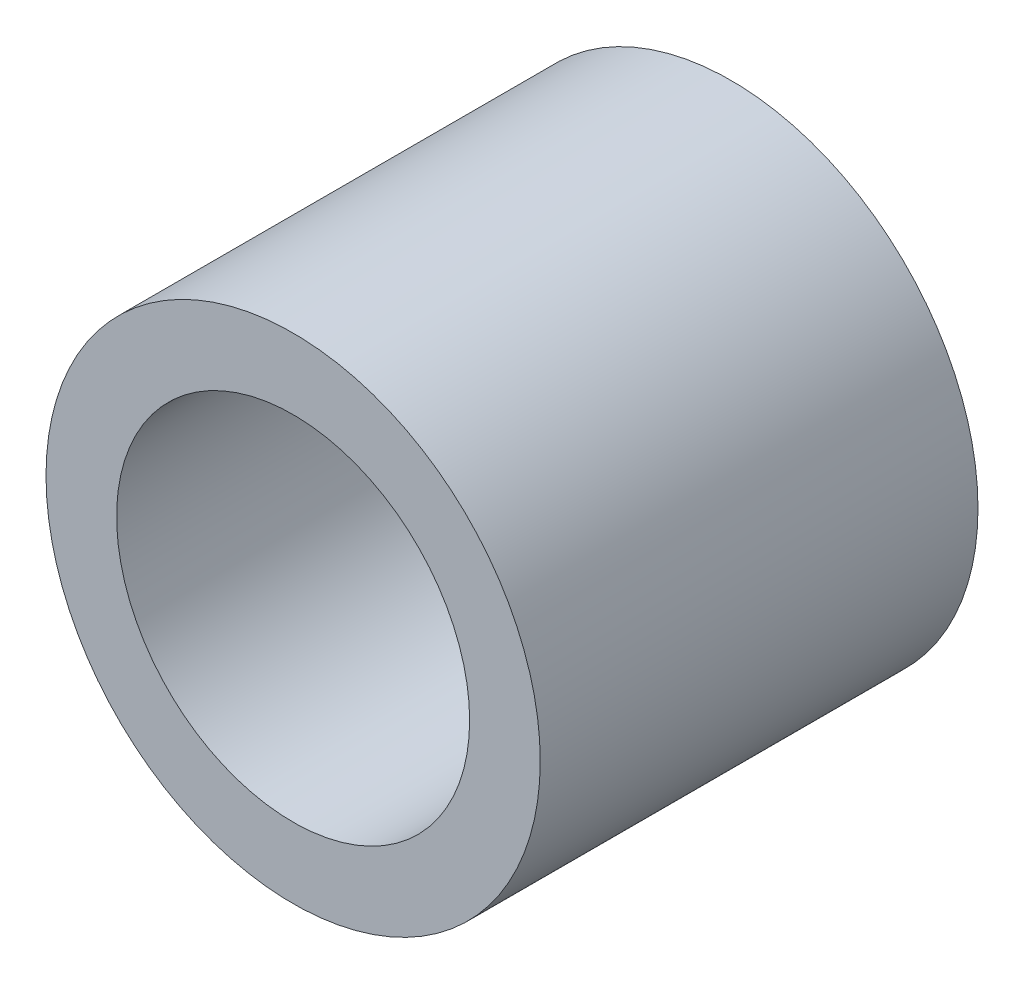
ISO-10303-21;
HEADER;
FILE_DESCRIPTION(('STEP AP214'),'2;1');
FILE_NAME('part.step','',(''),(''),'','','');
FILE_SCHEMA(('AUTOMOTIVE_DESIGN { 1 0 10303 214 1 1 1 1 }'));
ENDSEC;
DATA;
#1=APPLICATION_CONTEXT('core data for automotive mechanical design processes');
#2=APPLICATION_PROTOCOL_DEFINITION('international standard','automotive_design',2000,#1);
#3=PRODUCT_CONTEXT('',#1,'mechanical');
#4=PRODUCT('Part','Part','',(#3));
#5=PRODUCT_RELATED_PRODUCT_CATEGORY('part','',(#4));
#6=PRODUCT_DEFINITION_FORMATION('','',#4);
#7=PRODUCT_DEFINITION_CONTEXT('part definition',#1,'design');
#8=PRODUCT_DEFINITION('design','',#6,#7);
#9=PRODUCT_DEFINITION_SHAPE('','',#8);
#10=(LENGTH_UNIT() NAMED_UNIT(*) SI_UNIT(.MILLI.,.METRE.));
#11=(NAMED_UNIT(*) PLANE_ANGLE_UNIT() SI_UNIT($,.RADIAN.));
#12=(NAMED_UNIT(*) SI_UNIT($,.STERADIAN.) SOLID_ANGLE_UNIT());
#13=UNCERTAINTY_MEASURE_WITH_UNIT(LENGTH_MEASURE(1.E-05),#10,'distance_accuracy_value','');
#14=(GEOMETRIC_REPRESENTATION_CONTEXT(3) GLOBAL_UNCERTAINTY_ASSIGNED_CONTEXT((#13)) GLOBAL_UNIT_ASSIGNED_CONTEXT((#10,
#11,#12)) REPRESENTATION_CONTEXT('',''));
#15=CARTESIAN_POINT('',(0.,0.,0.));
#16=DIRECTION('',(0.,0.,1.));
#17=DIRECTION('',(1.,0.,0.));
#18=AXIS2_PLACEMENT_3D('',#15,#16,#17);
#19=CARTESIAN_POINT('',(0.,0.,31.));
#20=DIRECTION('',(0.,0.,1.));
#21=DIRECTION('',(1.,0.,0.));
#22=AXIS2_PLACEMENT_3D('',#19,#20,#21);
#23=PLANE('',#22);
#24=CARTESIAN_POINT('',(0.,0.,31.));
#25=DIRECTION('',(0.,0.,1.));
#26=DIRECTION('',(1.,0.,0.));
#27=AXIS2_PLACEMENT_3D('',#24,#25,#26);
#28=CIRCLE('',#27,17.5);
#29=CARTESIAN_POINT('',(17.5,0.,31.));
#30=VERTEX_POINT('',#29);
#31=EDGE_CURVE('E10',#30,#30,#28,.T.);
#32=ORIENTED_EDGE('',*,*,#31,.T.);
#33=EDGE_LOOP('',(#32));
#34=FACE_BOUND('',#33,.T.);
#35=CARTESIAN_POINT('',(0.,0.,31.));
#36=DIRECTION('',(0.,0.,1.));
#37=DIRECTION('',(1.,0.,0.));
#38=AXIS2_PLACEMENT_3D('',#35,#36,#37);
#39=CIRCLE('',#38,12.5);
#40=CARTESIAN_POINT('',(12.5,0.,31.));
#41=VERTEX_POINT('',#40);
#42=EDGE_CURVE('E41',#41,#41,#39,.T.);
#43=ORIENTED_EDGE('',*,*,#42,.F.);
#44=EDGE_LOOP('',(#43));
#45=FACE_BOUND('',#44,.T.);
#46=ADVANCED_FACE('F30',(#34,#45),#23,.T.);
#47=CARTESIAN_POINT('',(0.,0.,0.));
#48=DIRECTION('',(0.,0.,1.));
#49=DIRECTION('',(1.,0.,0.));
#50=AXIS2_PLACEMENT_3D('',#47,#48,#49);
#51=PLANE('',#50);
#52=CARTESIAN_POINT('',(0.,0.,0.));
#53=DIRECTION('',(0.,0.,1.));
#54=DIRECTION('',(1.,0.,0.));
#55=AXIS2_PLACEMENT_3D('',#52,#53,#54);
#56=CIRCLE('',#55,17.5);
#57=CARTESIAN_POINT('',(17.5,0.,0.));
#58=VERTEX_POINT('',#57);
#59=EDGE_CURVE('E34',#58,#58,#56,.T.);
#60=ORIENTED_EDGE('',*,*,#59,.F.);
#61=EDGE_LOOP('',(#60));
#62=FACE_BOUND('',#61,.T.);
#63=CARTESIAN_POINT('',(0.,0.,0.));
#64=DIRECTION('',(0.,0.,1.));
#65=DIRECTION('',(1.,0.,0.));
#66=AXIS2_PLACEMENT_3D('',#63,#64,#65);
#67=CIRCLE('',#66,12.5);
#68=CARTESIAN_POINT('',(12.5,0.,0.));
#69=VERTEX_POINT('',#68);
#70=EDGE_CURVE('E43',#69,#69,#67,.T.);
#71=ORIENTED_EDGE('',*,*,#70,.T.);
#72=EDGE_LOOP('',(#71));
#73=FACE_BOUND('',#72,.T.);
#74=ADVANCED_FACE('F53',(#62,#73),#51,.F.);
#75=CARTESIAN_POINT('',(0.,0.,31.));
#76=DIRECTION('',(0.,0.,-1.));
#77=DIRECTION('',(-1.,0.,0.));
#78=AXIS2_PLACEMENT_3D('',#75,#76,#77);
#79=CYLINDRICAL_SURFACE('',#78,17.5);
#80=ORIENTED_EDGE('',*,*,#31,.F.);
#81=EDGE_LOOP('',(#80));
#82=FACE_BOUND('',#81,.T.);
#83=ORIENTED_EDGE('',*,*,#59,.T.);
#84=EDGE_LOOP('',(#83));
#85=FACE_BOUND('',#84,.T.);
#86=ADVANCED_FACE('F32',(#82,#85),#79,.T.);
#87=CARTESIAN_POINT('',(0.,0.,31.));
#88=DIRECTION('',(0.,0.,-1.));
#89=DIRECTION('',(-1.,0.,0.));
#90=AXIS2_PLACEMENT_3D('',#87,#88,#89);
#91=CYLINDRICAL_SURFACE('',#90,12.5);
#92=ORIENTED_EDGE('',*,*,#42,.T.);
#93=EDGE_LOOP('',(#92));
#94=FACE_BOUND('',#93,.T.);
#95=ORIENTED_EDGE('',*,*,#70,.F.);
#96=EDGE_LOOP('',(#95));
#97=FACE_BOUND('',#96,.T.);
#98=ADVANCED_FACE('F49',(#94,#97),#91,.F.);
#99=CLOSED_SHELL('',(#46,#74,#86,#98));
#100=MANIFOLD_SOLID_BREP('B2',#99);
#101=ADVANCED_BREP_SHAPE_REPRESENTATION('',(#18,#100),#14);
#102=SHAPE_DEFINITION_REPRESENTATION(#9,#101);
ENDSEC;
END-ISO-10303-21;
